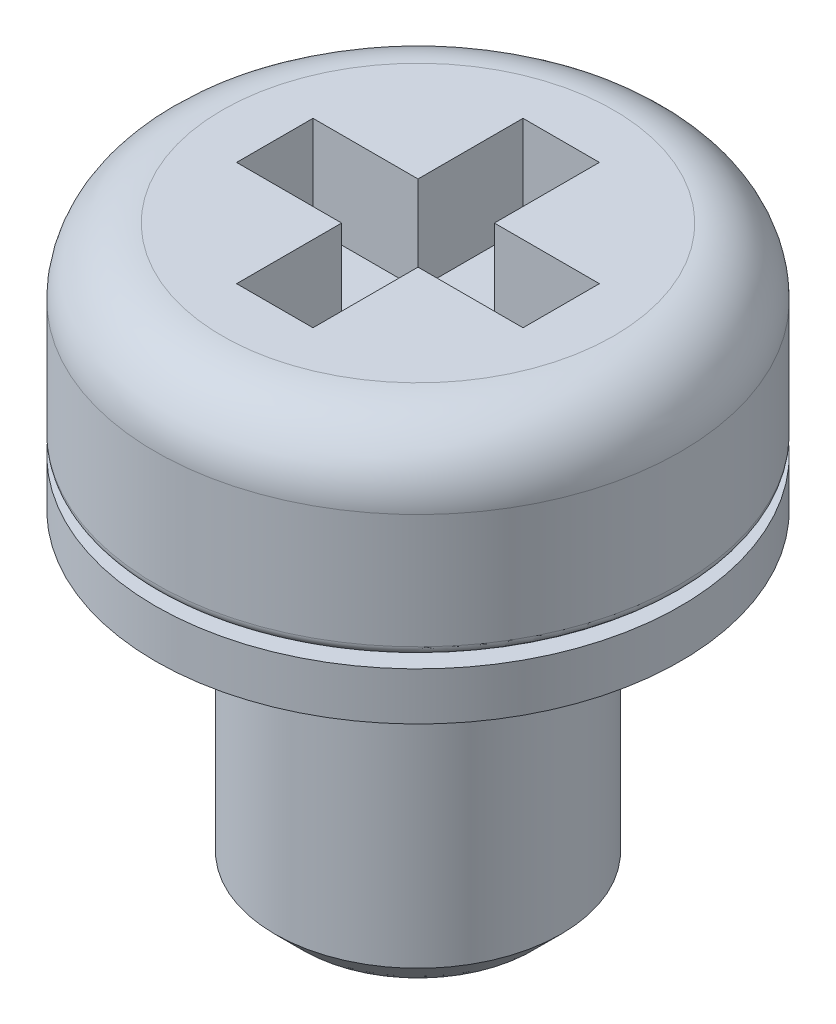
ISO-10303-21;
HEADER;
FILE_DESCRIPTION(('STEP AP214'),'2;1');
FILE_NAME('part.step','',(''),(''),'','','');
FILE_SCHEMA(('AUTOMOTIVE_DESIGN { 1 0 10303 214 1 1 1 1 }'));
ENDSEC;
DATA;
#1=APPLICATION_CONTEXT('core data for automotive mechanical design processes');
#2=APPLICATION_PROTOCOL_DEFINITION('international standard','automotive_design',2000,#1);
#3=PRODUCT_CONTEXT('',#1,'mechanical');
#4=PRODUCT('Part','Part','',(#3));
#5=PRODUCT_RELATED_PRODUCT_CATEGORY('part','',(#4));
#6=PRODUCT_DEFINITION_FORMATION('','',#4);
#7=PRODUCT_DEFINITION_CONTEXT('part definition',#1,'design');
#8=PRODUCT_DEFINITION('design','',#6,#7);
#9=PRODUCT_DEFINITION_SHAPE('','',#8);
#10=(LENGTH_UNIT() NAMED_UNIT(*) SI_UNIT(.MILLI.,.METRE.));
#11=(NAMED_UNIT(*) PLANE_ANGLE_UNIT() SI_UNIT($,.RADIAN.));
#12=(NAMED_UNIT(*) SI_UNIT($,.STERADIAN.) SOLID_ANGLE_UNIT());
#13=UNCERTAINTY_MEASURE_WITH_UNIT(LENGTH_MEASURE(1.E-05),#10,'distance_accuracy_value','');
#14=(GEOMETRIC_REPRESENTATION_CONTEXT(3) GLOBAL_UNCERTAINTY_ASSIGNED_CONTEXT((#13)) GLOBAL_UNIT_ASSIGNED_CONTEXT((#10,
#11,#12)) REPRESENTATION_CONTEXT('',''));
#15=CARTESIAN_POINT('',(0.,0.,0.));
#16=DIRECTION('',(0.,0.,1.));
#17=DIRECTION('',(1.,0.,0.));
#18=AXIS2_PLACEMENT_3D('',#15,#16,#17);
#19=CARTESIAN_POINT('',(68.752,0.1,-43.752));
#20=DIRECTION('',(0.,1.,0.));
#21=DIRECTION('',(1.,0.,0.));
#22=AXIS2_PLACEMENT_3D('',#19,#20,#21);
#23=PLANE('',#22);
#24=CARTESIAN_POINT('',(70.,0.0999999999758259,-45.));
#25=DIRECTION('',(0.,1.,0.));
#26=DIRECTION('',(0.,0.,1.));
#27=AXIS2_PLACEMENT_3D('',#24,#25,#26);
#28=CIRCLE('',#27,1.19999999997188);
#29=CARTESIAN_POINT('',(70.,0.0999999999758259,-43.8000000000281));
#30=VERTEX_POINT('',#29);
#31=EDGE_CURVE('P0_E165',#30,#30,#28,.F.);
#32=ORIENTED_EDGE('',*,*,#31,.T.);
#33=EDGE_LOOP('',(#32));
#34=FACE_BOUND('',#33,.T.);
#35=ADVANCED_FACE('P0_F17',(#34),#23,.F.);
#36=CARTESIAN_POINT('',(70.,0.0999999999758259,-45.));
#37=DIRECTION('',(0.,1.,0.));
#38=DIRECTION('',(0.,0.,1.));
#39=AXIS2_PLACEMENT_3D('',#36,#37,#38);
#40=CONICAL_SURFACE('',#39,1.19999999997188,0.785398163400928);
#41=CARTESIAN_POINT('',(70.,0.400000000000003,-45.));
#42=DIRECTION('',(0.,1.,0.));
#43=DIRECTION('',(1.,0.,0.));
#44=AXIS2_PLACEMENT_3D('',#41,#42,#43);
#45=CIRCLE('',#44,1.5);
#46=CARTESIAN_POINT('',(71.5,0.400000000000003,-45.));
#47=VERTEX_POINT('',#46);
#48=EDGE_CURVE('P0_E161',#47,#47,#45,.F.);
#49=ORIENTED_EDGE('',*,*,#48,.T.);
#50=EDGE_LOOP('',(#49));
#51=FACE_BOUND('',#50,.T.);
#52=ORIENTED_EDGE('',*,*,#31,.F.);
#53=EDGE_LOOP('',(#52));
#54=FACE_BOUND('',#53,.T.);
#55=ADVANCED_FACE('P0_F537',(#51,#54),#40,.T.);
#56=CARTESIAN_POINT('',(70.,0.400000000000003,-45.));
#57=DIRECTION('',(0.,1.,0.));
#58=DIRECTION('',(0.,0.,1.));
#59=AXIS2_PLACEMENT_3D('',#56,#57,#58);
#60=CYLINDRICAL_SURFACE('',#59,1.5);
#61=CARTESIAN_POINT('',(70.,3.5000000000001,-45.));
#62=DIRECTION('',(0.,1.,0.));
#63=DIRECTION('',(0.,0.,1.));
#64=AXIS2_PLACEMENT_3D('',#61,#62,#63);
#65=CIRCLE('',#64,1.5);
#66=CARTESIAN_POINT('',(70.,3.5000000000001,-43.5));
#67=VERTEX_POINT('',#66);
#68=EDGE_CURVE('P0_E164',#67,#67,#65,.T.);
#69=ORIENTED_EDGE('',*,*,#68,.F.);
#70=EDGE_LOOP('',(#69));
#71=FACE_BOUND('',#70,.T.);
#72=ORIENTED_EDGE('',*,*,#48,.F.);
#73=EDGE_LOOP('',(#72));
#74=FACE_BOUND('',#73,.T.);
#75=ADVANCED_FACE('P0_F527',(#71,#74),#60,.T.);
#76=CARTESIAN_POINT('',(67.13764442251,3.5,-42.14));
#77=DIRECTION('',(0.,-1.,0.));
#78=DIRECTION('',(0.,0.,-1.));
#79=AXIS2_PLACEMENT_3D('',#76,#77,#78);
#80=PLANE('',#79);
#81=ORIENTED_EDGE('',*,*,#68,.T.);
#82=EDGE_LOOP('',(#81));
#83=FACE_BOUND('',#82,.T.);
#84=CARTESIAN_POINT('',(70.,3.4999999999996,-45.));
#85=DIRECTION('',(0.,-1.,0.));
#86=DIRECTION('',(0.,0.,-1.));
#87=AXIS2_PLACEMENT_3D('',#84,#85,#86);
#88=CIRCLE('',#87,2.75);
#89=CARTESIAN_POINT('',(70.,3.4999999999996,-47.75));
#90=VERTEX_POINT('',#89);
#91=EDGE_CURVE('P0_E219',#90,#90,#88,.T.);
#92=ORIENTED_EDGE('',*,*,#91,.T.);
#93=EDGE_LOOP('',(#92));
#94=FACE_BOUND('',#93,.T.);
#95=ADVANCED_FACE('P0_F517',(#83,#94),#80,.T.);
#96=CARTESIAN_POINT('',(70.,4.00000000000041,-45.));
#97=DIRECTION('',(0.,-1.,0.));
#98=DIRECTION('',(0.,0.,-1.));
#99=AXIS2_PLACEMENT_3D('',#96,#97,#98);
#100=CYLINDRICAL_SURFACE('',#99,2.75);
#101=ORIENTED_EDGE('',*,*,#91,.F.);
#102=EDGE_LOOP('',(#101));
#103=FACE_BOUND('',#102,.T.);
#104=CARTESIAN_POINT('',(70.,4.00000000000041,-45.));
#105=DIRECTION('',(0.,-1.,0.));
#106=DIRECTION('',(0.,0.,-1.));
#107=AXIS2_PLACEMENT_3D('',#104,#105,#106);
#108=CIRCLE('',#107,2.75);
#109=CARTESIAN_POINT('',(70.,4.00000000000041,-47.75));
#110=VERTEX_POINT('',#109);
#111=EDGE_CURVE('P0_E216',#110,#110,#108,.T.);
#112=ORIENTED_EDGE('',*,*,#111,.T.);
#113=EDGE_LOOP('',(#112));
#114=FACE_BOUND('',#113,.T.);
#115=ADVANCED_FACE('P0_F507',(#103,#114),#100,.T.);
#116=CARTESIAN_POINT('',(67.13764442251,4.,-42.14));
#117=DIRECTION('',(0.,-1.,0.));
#118=DIRECTION('',(0.,0.,-1.));
#119=AXIS2_PLACEMENT_3D('',#116,#117,#118);
#120=PLANE('',#119);
#121=CARTESIAN_POINT('',(70.,3.99999999999998,-45.));
#122=DIRECTION('',(0.,1.,0.));
#123=DIRECTION('',(0.,0.,1.));
#124=AXIS2_PLACEMENT_3D('',#121,#122,#123);
#125=CIRCLE('',#124,1.5);
#126=CARTESIAN_POINT('',(70.,3.99999999999998,-43.5));
#127=VERTEX_POINT('',#126);
#128=EDGE_CURVE('P0_E143',#127,#127,#125,.F.);
#129=ORIENTED_EDGE('',*,*,#128,.T.);
#130=EDGE_LOOP('',(#129));
#131=FACE_BOUND('',#130,.T.);
#132=ORIENTED_EDGE('',*,*,#111,.F.);
#133=EDGE_LOOP('',(#132));
#134=FACE_BOUND('',#133,.T.);
#135=ADVANCED_FACE('P0_F498',(#131,#134),#120,.F.);
#136=CARTESIAN_POINT('',(71.56,5.1,-43.44));
#137=DIRECTION('',(0.,1.,0.));
#138=DIRECTION('',(0.,0.,-1.));
#139=AXIS2_PLACEMENT_3D('',#136,#137,#138);
#140=PLANE('',#139);
#141=DIRECTION('',(-1.,0.,0.));
#142=VECTOR('',#141,1.);
#143=CARTESIAN_POINT('',(69.05,5.1,-45.4));
#144=LINE('',#143,#142);
#145=CARTESIAN_POINT('',(69.6,5.1,-45.4));
#146=VERTEX_POINT('',#145);
#147=CARTESIAN_POINT('',(68.5,5.1,-45.4));
#148=VERTEX_POINT('',#147);
#149=EDGE_CURVE('P0_E150',#146,#148,#144,.T.);
#150=ORIENTED_EDGE('',*,*,#149,.T.);
#151=DIRECTION('',(0.,0.,1.));
#152=VECTOR('',#151,1.);
#153=CARTESIAN_POINT('',(68.5,5.1,-45.));
#154=LINE('',#153,#152);
#155=CARTESIAN_POINT('',(68.5,5.1,-44.6));
#156=VERTEX_POINT('',#155);
#157=EDGE_CURVE('P0_E142',#148,#156,#154,.T.);
#158=ORIENTED_EDGE('',*,*,#157,.T.);
#159=DIRECTION('',(1.,0.,0.));
#160=VECTOR('',#159,1.);
#161=CARTESIAN_POINT('',(69.05,5.1,-44.6));
#162=LINE('',#161,#160);
#163=CARTESIAN_POINT('',(69.6,5.1,-44.6));
#164=VERTEX_POINT('',#163);
#165=EDGE_CURVE('P0_E131',#156,#164,#162,.T.);
#166=ORIENTED_EDGE('',*,*,#165,.T.);
#167=DIRECTION('',(0.,0.,1.));
#168=VECTOR('',#167,1.);
#169=CARTESIAN_POINT('',(69.6,5.1,-44.05));
#170=LINE('',#169,#168);
#171=CARTESIAN_POINT('',(69.6,5.1,-43.5));
#172=VERTEX_POINT('',#171);
#173=EDGE_CURVE('P0_E290',#164,#172,#170,.T.);
#174=ORIENTED_EDGE('',*,*,#173,.T.);
#175=DIRECTION('',(1.,0.,0.));
#176=VECTOR('',#175,1.);
#177=CARTESIAN_POINT('',(70.,5.1,-43.5));
#178=LINE('',#177,#176);
#179=CARTESIAN_POINT('',(70.4,5.1,-43.5));
#180=VERTEX_POINT('',#179);
#181=EDGE_CURVE('P0_E296',#172,#180,#178,.T.);
#182=ORIENTED_EDGE('',*,*,#181,.T.);
#183=DIRECTION('',(0.,0.,-1.));
#184=VECTOR('',#183,1.);
#185=CARTESIAN_POINT('',(70.4,5.1,-44.05));
#186=LINE('',#185,#184);
#187=CARTESIAN_POINT('',(70.4,5.1,-44.6));
#188=VERTEX_POINT('',#187);
#189=EDGE_CURVE('P0_E302',#180,#188,#186,.T.);
#190=ORIENTED_EDGE('',*,*,#189,.T.);
#191=DIRECTION('',(1.,0.,0.));
#192=VECTOR('',#191,1.);
#193=CARTESIAN_POINT('',(70.95,5.1,-44.6));
#194=LINE('',#193,#192);
#195=CARTESIAN_POINT('',(71.5,5.1,-44.6));
#196=VERTEX_POINT('',#195);
#197=EDGE_CURVE('P0_E308',#188,#196,#194,.T.);
#198=ORIENTED_EDGE('',*,*,#197,.T.);
#199=DIRECTION('',(0.,0.,-1.));
#200=VECTOR('',#199,1.);
#201=CARTESIAN_POINT('',(71.5,5.1,-45.));
#202=LINE('',#201,#200);
#203=CARTESIAN_POINT('',(71.5,5.1,-45.4));
#204=VERTEX_POINT('',#203);
#205=EDGE_CURVE('P0_E314',#196,#204,#202,.T.);
#206=ORIENTED_EDGE('',*,*,#205,.T.);
#207=DIRECTION('',(-1.,0.,0.));
#208=VECTOR('',#207,1.);
#209=CARTESIAN_POINT('',(70.95,5.1,-45.4));
#210=LINE('',#209,#208);
#211=CARTESIAN_POINT('',(70.4,5.1,-45.4));
#212=VERTEX_POINT('',#211);
#213=EDGE_CURVE('P0_E320',#204,#212,#210,.T.);
#214=ORIENTED_EDGE('',*,*,#213,.T.);
#215=DIRECTION('',(0.,0.,-1.));
#216=VECTOR('',#215,1.);
#217=CARTESIAN_POINT('',(70.4,5.1,-45.95));
#218=LINE('',#217,#216);
#219=CARTESIAN_POINT('',(70.4,5.1,-46.5));
#220=VERTEX_POINT('',#219);
#221=EDGE_CURVE('P0_E326',#212,#220,#218,.T.);
#222=ORIENTED_EDGE('',*,*,#221,.T.);
#223=DIRECTION('',(-1.,0.,0.));
#224=VECTOR('',#223,1.);
#225=CARTESIAN_POINT('',(70.,5.1,-46.5));
#226=LINE('',#225,#224);
#227=CARTESIAN_POINT('',(69.6,5.1,-46.5));
#228=VERTEX_POINT('',#227);
#229=EDGE_CURVE('P0_E332',#220,#228,#226,.T.);
#230=ORIENTED_EDGE('',*,*,#229,.T.);
#231=DIRECTION('',(0.,0.,1.));
#232=VECTOR('',#231,1.);
#233=CARTESIAN_POINT('',(69.6,5.1,-45.95));
#234=LINE('',#233,#232);
#235=EDGE_CURVE('P0_E338',#228,#146,#234,.T.);
#236=ORIENTED_EDGE('',*,*,#235,.T.);
#237=EDGE_LOOP('',(#150,#158,#166,#174,#182,#190,#198,#206,#214,#222,#230,#236));
#238=FACE_BOUND('',#237,.T.);
#239=ADVANCED_FACE('P0_F153',(#238),#140,.T.);
#240=CARTESIAN_POINT('',(70.,3.99999999999998,-45.));
#241=DIRECTION('',(0.,1.,0.));
#242=DIRECTION('',(0.,0.,1.));
#243=AXIS2_PLACEMENT_3D('',#240,#241,#242);
#244=CYLINDRICAL_SURFACE('',#243,1.5);
#245=CARTESIAN_POINT('',(70.,4.09999999999988,-45.));
#246=DIRECTION('',(0.,1.,0.));
#247=DIRECTION('',(0.,0.,1.));
#248=AXIS2_PLACEMENT_3D('',#245,#246,#247);
#249=CIRCLE('',#248,1.5);
#250=CARTESIAN_POINT('',(70.,4.09999999999988,-43.5));
#251=VERTEX_POINT('',#250);
#252=EDGE_CURVE('P0_E206',#251,#251,#249,.F.);
#253=ORIENTED_EDGE('',*,*,#252,.T.);
#254=EDGE_LOOP('',(#253));
#255=FACE_BOUND('',#254,.T.);
#256=ORIENTED_EDGE('',*,*,#128,.F.);
#257=EDGE_LOOP('',(#256));
#258=FACE_BOUND('',#257,.T.);
#259=ADVANCED_FACE('P0_F481',(#255,#258),#244,.T.);
#260=CARTESIAN_POINT('',(68.478,5.08,-44.6));
#261=DIRECTION('',(0.,0.,1.));
#262=DIRECTION('',(1.,0.,0.));
#263=AXIS2_PLACEMENT_3D('',#260,#261,#262);
#264=PLANE('',#263);
#265=ORIENTED_EDGE('',*,*,#165,.F.);
#266=DIRECTION('',(0.,1.,0.));
#267=VECTOR('',#266,1.);
#268=CARTESIAN_POINT('',(68.5,5.6,-44.6));
#269=LINE('',#268,#267);
#270=CARTESIAN_POINT('',(68.5,6.1,-44.6));
#271=VERTEX_POINT('',#270);
#272=EDGE_CURVE('P0_E135',#156,#271,#269,.T.);
#273=ORIENTED_EDGE('',*,*,#272,.T.);
#274=DIRECTION('',(-1.,0.,0.));
#275=VECTOR('',#274,1.);
#276=CARTESIAN_POINT('',(70.,6.1,-44.6));
#277=LINE('',#276,#275);
#278=CARTESIAN_POINT('',(69.6,6.1,-44.6));
#279=VERTEX_POINT('',#278);
#280=EDGE_CURVE('P0_E269',#279,#271,#277,.T.);
#281=ORIENTED_EDGE('',*,*,#280,.F.);
#282=DIRECTION('',(0.,-1.,0.));
#283=VECTOR('',#282,1.);
#284=CARTESIAN_POINT('',(69.6,5.6,-44.6));
#285=LINE('',#284,#283);
#286=EDGE_CURVE('P0_E137',#279,#164,#285,.T.);
#287=ORIENTED_EDGE('',*,*,#286,.T.);
#288=EDGE_LOOP('',(#265,#273,#281,#287));
#289=FACE_BOUND('',#288,.T.);
#290=ADVANCED_FACE('P0_F133',(#289),#264,.F.);
#291=CARTESIAN_POINT('',(68.5,5.08,-45.416));
#292=DIRECTION('',(-1.,0.,0.));
#293=DIRECTION('',(0.,0.,1.));
#294=AXIS2_PLACEMENT_3D('',#291,#292,#293);
#295=PLANE('',#294);
#296=ORIENTED_EDGE('',*,*,#157,.F.);
#297=DIRECTION('',(0.,1.,0.));
#298=VECTOR('',#297,1.);
#299=CARTESIAN_POINT('',(68.5,5.6,-45.4));
#300=LINE('',#299,#298);
#301=CARTESIAN_POINT('',(68.5,6.1,-45.4));
#302=VERTEX_POINT('',#301);
#303=EDGE_CURVE('P0_E340',#148,#302,#300,.T.);
#304=ORIENTED_EDGE('',*,*,#303,.T.);
#305=DIRECTION('',(0.,0.,-1.));
#306=VECTOR('',#305,1.);
#307=CARTESIAN_POINT('',(68.5,6.1,-45.));
#308=LINE('',#307,#306);
#309=EDGE_CURVE('P0_E149',#271,#302,#308,.T.);
#310=ORIENTED_EDGE('',*,*,#309,.F.);
#311=ORIENTED_EDGE('',*,*,#272,.F.);
#312=EDGE_LOOP('',(#296,#304,#310,#311));
#313=FACE_BOUND('',#312,.T.);
#314=ADVANCED_FACE('P0_F146',(#313),#295,.F.);
#315=CARTESIAN_POINT('',(69.622,5.08,-45.4));
#316=DIRECTION('',(0.,0.,-1.));
#317=DIRECTION('',(-1.,0.,0.));
#318=AXIS2_PLACEMENT_3D('',#315,#316,#317);
#319=PLANE('',#318);
#320=ORIENTED_EDGE('',*,*,#149,.F.);
#321=DIRECTION('',(0.,1.,0.));
#322=VECTOR('',#321,1.);
#323=CARTESIAN_POINT('',(69.6,5.6,-45.4));
#324=LINE('',#323,#322);
#325=CARTESIAN_POINT('',(69.6,6.1,-45.4));
#326=VERTEX_POINT('',#325);
#327=EDGE_CURVE('P0_E335',#146,#326,#324,.T.);
#328=ORIENTED_EDGE('',*,*,#327,.T.);
#329=DIRECTION('',(1.,0.,0.));
#330=VECTOR('',#329,1.);
#331=CARTESIAN_POINT('',(70.,6.1,-45.4));
#332=LINE('',#331,#330);
#333=EDGE_CURVE('P0_E266',#302,#326,#332,.T.);
#334=ORIENTED_EDGE('',*,*,#333,.F.);
#335=ORIENTED_EDGE('',*,*,#303,.F.);
#336=EDGE_LOOP('',(#320,#328,#334,#335));
#337=FACE_BOUND('',#336,.T.);
#338=ADVANCED_FACE('P0_F343',(#337),#319,.F.);
#339=CARTESIAN_POINT('',(69.6,5.08,-46.522));
#340=DIRECTION('',(-1.,0.,0.));
#341=DIRECTION('',(0.,0.,1.));
#342=AXIS2_PLACEMENT_3D('',#339,#340,#341);
#343=PLANE('',#342);
#344=ORIENTED_EDGE('',*,*,#235,.F.);
#345=DIRECTION('',(0.,1.,0.));
#346=VECTOR('',#345,1.);
#347=CARTESIAN_POINT('',(69.6,5.6,-46.5));
#348=LINE('',#347,#346);
#349=CARTESIAN_POINT('',(69.6,6.1,-46.5));
#350=VERTEX_POINT('',#349);
#351=EDGE_CURVE('P0_E329',#228,#350,#348,.T.);
#352=ORIENTED_EDGE('',*,*,#351,.T.);
#353=DIRECTION('',(0.,0.,-1.));
#354=VECTOR('',#353,1.);
#355=CARTESIAN_POINT('',(69.6,6.1,-45.));
#356=LINE('',#355,#354);
#357=EDGE_CURVE('P0_E264',#326,#350,#356,.T.);
#358=ORIENTED_EDGE('',*,*,#357,.F.);
#359=ORIENTED_EDGE('',*,*,#327,.F.);
#360=EDGE_LOOP('',(#344,#352,#358,#359));
#361=FACE_BOUND('',#360,.T.);
#362=ADVANCED_FACE('P0_F377',(#361),#343,.F.);
#363=CARTESIAN_POINT('',(70.416,5.08,-46.5));
#364=DIRECTION('',(0.,0.,-1.));
#365=DIRECTION('',(-1.,0.,0.));
#366=AXIS2_PLACEMENT_3D('',#363,#364,#365);
#367=PLANE('',#366);
#368=ORIENTED_EDGE('',*,*,#229,.F.);
#369=DIRECTION('',(0.,1.,0.));
#370=VECTOR('',#369,1.);
#371=CARTESIAN_POINT('',(70.4,5.6,-46.5));
#372=LINE('',#371,#370);
#373=CARTESIAN_POINT('',(70.4,6.1,-46.5));
#374=VERTEX_POINT('',#373);
#375=EDGE_CURVE('P0_E323',#220,#374,#372,.T.);
#376=ORIENTED_EDGE('',*,*,#375,.T.);
#377=DIRECTION('',(1.,0.,0.));
#378=VECTOR('',#377,1.);
#379=CARTESIAN_POINT('',(70.,6.1,-46.5));
#380=LINE('',#379,#378);
#381=EDGE_CURVE('P0_E262',#350,#374,#380,.T.);
#382=ORIENTED_EDGE('',*,*,#381,.F.);
#383=ORIENTED_EDGE('',*,*,#351,.F.);
#384=EDGE_LOOP('',(#368,#376,#382,#383));
#385=FACE_BOUND('',#384,.T.);
#386=ADVANCED_FACE('P0_F374',(#385),#367,.F.);
#387=CARTESIAN_POINT('',(70.4,5.08,-45.378));
#388=DIRECTION('',(1.,0.,0.));
#389=DIRECTION('',(0.,0.,-1.));
#390=AXIS2_PLACEMENT_3D('',#387,#388,#389);
#391=PLANE('',#390);
#392=ORIENTED_EDGE('',*,*,#221,.F.);
#393=DIRECTION('',(0.,1.,0.));
#394=VECTOR('',#393,1.);
#395=CARTESIAN_POINT('',(70.4,5.6,-45.4));
#396=LINE('',#395,#394);
#397=CARTESIAN_POINT('',(70.4,6.1,-45.4));
#398=VERTEX_POINT('',#397);
#399=EDGE_CURVE('P0_E317',#212,#398,#396,.T.);
#400=ORIENTED_EDGE('',*,*,#399,.T.);
#401=DIRECTION('',(0.,0.,1.));
#402=VECTOR('',#401,1.);
#403=CARTESIAN_POINT('',(70.4,6.1,-45.));
#404=LINE('',#403,#402);
#405=EDGE_CURVE('P0_E260',#374,#398,#404,.T.);
#406=ORIENTED_EDGE('',*,*,#405,.F.);
#407=ORIENTED_EDGE('',*,*,#375,.F.);
#408=EDGE_LOOP('',(#392,#400,#406,#407));
#409=FACE_BOUND('',#408,.T.);
#410=ADVANCED_FACE('P0_F370',(#409),#391,.F.);
#411=CARTESIAN_POINT('',(71.522,5.08,-45.4));
#412=DIRECTION('',(0.,0.,-1.));
#413=DIRECTION('',(-1.,0.,0.));
#414=AXIS2_PLACEMENT_3D('',#411,#412,#413);
#415=PLANE('',#414);
#416=ORIENTED_EDGE('',*,*,#213,.F.);
#417=DIRECTION('',(0.,1.,0.));
#418=VECTOR('',#417,1.);
#419=CARTESIAN_POINT('',(71.5,5.6,-45.4));
#420=LINE('',#419,#418);
#421=CARTESIAN_POINT('',(71.5,6.1,-45.4));
#422=VERTEX_POINT('',#421);
#423=EDGE_CURVE('P0_E311',#204,#422,#420,.T.);
#424=ORIENTED_EDGE('',*,*,#423,.T.);
#425=DIRECTION('',(1.,0.,0.));
#426=VECTOR('',#425,1.);
#427=CARTESIAN_POINT('',(70.,6.1,-45.4));
#428=LINE('',#427,#426);
#429=EDGE_CURVE('P0_E258',#398,#422,#428,.T.);
#430=ORIENTED_EDGE('',*,*,#429,.F.);
#431=ORIENTED_EDGE('',*,*,#399,.F.);
#432=EDGE_LOOP('',(#416,#424,#430,#431));
#433=FACE_BOUND('',#432,.T.);
#434=ADVANCED_FACE('P0_F366',(#433),#415,.F.);
#435=CARTESIAN_POINT('',(71.5,5.08,-44.584));
#436=DIRECTION('',(1.,0.,0.));
#437=DIRECTION('',(0.,0.,-1.));
#438=AXIS2_PLACEMENT_3D('',#435,#436,#437);
#439=PLANE('',#438);
#440=ORIENTED_EDGE('',*,*,#205,.F.);
#441=DIRECTION('',(0.,1.,0.));
#442=VECTOR('',#441,1.);
#443=CARTESIAN_POINT('',(71.5,5.6,-44.6));
#444=LINE('',#443,#442);
#445=CARTESIAN_POINT('',(71.5,6.1,-44.6));
#446=VERTEX_POINT('',#445);
#447=EDGE_CURVE('P0_E305',#196,#446,#444,.T.);
#448=ORIENTED_EDGE('',*,*,#447,.T.);
#449=DIRECTION('',(0.,0.,1.));
#450=VECTOR('',#449,1.);
#451=CARTESIAN_POINT('',(71.5,6.1,-45.));
#452=LINE('',#451,#450);
#453=EDGE_CURVE('P0_E256',#422,#446,#452,.T.);
#454=ORIENTED_EDGE('',*,*,#453,.F.);
#455=ORIENTED_EDGE('',*,*,#423,.F.);
#456=EDGE_LOOP('',(#440,#448,#454,#455));
#457=FACE_BOUND('',#456,.T.);
#458=ADVANCED_FACE('P0_F362',(#457),#439,.F.);
#459=CARTESIAN_POINT('',(70.378,5.08,-44.6));
#460=DIRECTION('',(0.,0.,1.));
#461=DIRECTION('',(1.,0.,0.));
#462=AXIS2_PLACEMENT_3D('',#459,#460,#461);
#463=PLANE('',#462);
#464=ORIENTED_EDGE('',*,*,#197,.F.);
#465=DIRECTION('',(0.,1.,0.));
#466=VECTOR('',#465,1.);
#467=CARTESIAN_POINT('',(70.4,5.6,-44.6));
#468=LINE('',#467,#466);
#469=CARTESIAN_POINT('',(70.4,6.1,-44.6));
#470=VERTEX_POINT('',#469);
#471=EDGE_CURVE('P0_E299',#188,#470,#468,.T.);
#472=ORIENTED_EDGE('',*,*,#471,.T.);
#473=DIRECTION('',(-1.,0.,0.));
#474=VECTOR('',#473,1.);
#475=CARTESIAN_POINT('',(70.,6.1,-44.6));
#476=LINE('',#475,#474);
#477=EDGE_CURVE('P0_E254',#446,#470,#476,.T.);
#478=ORIENTED_EDGE('',*,*,#477,.F.);
#479=ORIENTED_EDGE('',*,*,#447,.F.);
#480=EDGE_LOOP('',(#464,#472,#478,#479));
#481=FACE_BOUND('',#480,.T.);
#482=ADVANCED_FACE('P0_F358',(#481),#463,.F.);
#483=CARTESIAN_POINT('',(70.4,5.08,-43.478));
#484=DIRECTION('',(1.,0.,0.));
#485=DIRECTION('',(0.,0.,-1.));
#486=AXIS2_PLACEMENT_3D('',#483,#484,#485);
#487=PLANE('',#486);
#488=ORIENTED_EDGE('',*,*,#189,.F.);
#489=DIRECTION('',(0.,1.,0.));
#490=VECTOR('',#489,1.);
#491=CARTESIAN_POINT('',(70.4,5.6,-43.5));
#492=LINE('',#491,#490);
#493=CARTESIAN_POINT('',(70.4,6.1,-43.5));
#494=VERTEX_POINT('',#493);
#495=EDGE_CURVE('P0_E293',#180,#494,#492,.T.);
#496=ORIENTED_EDGE('',*,*,#495,.T.);
#497=DIRECTION('',(0.,0.,1.));
#498=VECTOR('',#497,1.);
#499=CARTESIAN_POINT('',(70.4,6.1,-45.));
#500=LINE('',#499,#498);
#501=EDGE_CURVE('P0_E252',#470,#494,#500,.T.);
#502=ORIENTED_EDGE('',*,*,#501,.F.);
#503=ORIENTED_EDGE('',*,*,#471,.F.);
#504=EDGE_LOOP('',(#488,#496,#502,#503));
#505=FACE_BOUND('',#504,.T.);
#506=ADVANCED_FACE('P0_F354',(#505),#487,.F.);
#507=CARTESIAN_POINT('',(69.584,5.08,-43.5));
#508=DIRECTION('',(0.,0.,1.));
#509=DIRECTION('',(1.,0.,0.));
#510=AXIS2_PLACEMENT_3D('',#507,#508,#509);
#511=PLANE('',#510);
#512=ORIENTED_EDGE('',*,*,#181,.F.);
#513=DIRECTION('',(0.,1.,0.));
#514=VECTOR('',#513,1.);
#515=CARTESIAN_POINT('',(69.6,5.6,-43.5));
#516=LINE('',#515,#514);
#517=CARTESIAN_POINT('',(69.6,6.1,-43.5));
#518=VERTEX_POINT('',#517);
#519=EDGE_CURVE('P0_E283',#172,#518,#516,.T.);
#520=ORIENTED_EDGE('',*,*,#519,.T.);
#521=DIRECTION('',(-1.,0.,0.));
#522=VECTOR('',#521,1.);
#523=CARTESIAN_POINT('',(70.,6.1,-43.5));
#524=LINE('',#523,#522);
#525=EDGE_CURVE('P0_E60',#494,#518,#524,.T.);
#526=ORIENTED_EDGE('',*,*,#525,.F.);
#527=ORIENTED_EDGE('',*,*,#495,.F.);
#528=EDGE_LOOP('',(#512,#520,#526,#527));
#529=FACE_BOUND('',#528,.T.);
#530=ADVANCED_FACE('P0_F351',(#529),#511,.F.);
#531=CARTESIAN_POINT('',(69.6,5.08,-44.622));
#532=DIRECTION('',(-1.,0.,0.));
#533=DIRECTION('',(0.,0.,1.));
#534=AXIS2_PLACEMENT_3D('',#531,#532,#533);
#535=PLANE('',#534);
#536=ORIENTED_EDGE('',*,*,#173,.F.);
#537=ORIENTED_EDGE('',*,*,#286,.F.);
#538=DIRECTION('',(0.,0.,-1.));
#539=VECTOR('',#538,1.);
#540=CARTESIAN_POINT('',(69.6,6.1,-45.));
#541=LINE('',#540,#539);
#542=EDGE_CURVE('P0_E249',#518,#279,#541,.T.);
#543=ORIENTED_EDGE('',*,*,#542,.F.);
#544=ORIENTED_EDGE('',*,*,#519,.F.);
#545=EDGE_LOOP('',(#536,#537,#543,#544));
#546=FACE_BOUND('',#545,.T.);
#547=ADVANCED_FACE('P0_F180',(#546),#535,.F.);
#548=CARTESIAN_POINT('',(67.244,4.1,-42.244));
#549=DIRECTION('',(0.,1.,0.));
#550=DIRECTION('',(1.,0.,0.));
#551=AXIS2_PLACEMENT_3D('',#548,#549,#550);
#552=PLANE('',#551);
#553=ORIENTED_EDGE('',*,*,#252,.F.);
#554=EDGE_LOOP('',(#553));
#555=FACE_BOUND('',#554,.T.);
#556=CARTESIAN_POINT('',(70.,4.1,-45.));
#557=DIRECTION('',(0.,1.,0.));
#558=DIRECTION('',(-1.,0.,2.28852576302784E-12));
#559=AXIS2_PLACEMENT_3D('',#556,#557,#558);
#560=CIRCLE('',#559,2.64999999999613);
#561=CARTESIAN_POINT('',(72.6499999999977,4.1,-45.0000000000036));
#562=VERTEX_POINT('',#561);
#563=CARTESIAN_POINT('',(67.3500000000023,4.1,-44.9999999999964));
#564=VERTEX_POINT('',#563);
#565=EDGE_CURVE('P0_E167',#562,#564,#560,.F.);
#566=ORIENTED_EDGE('',*,*,#565,.T.);
#567=CARTESIAN_POINT('',(70.,4.1,-45.));
#568=DIRECTION('',(0.,1.,0.));
#569=DIRECTION('',(1.,0.,-2.29114421355762E-12));
#570=AXIS2_PLACEMENT_3D('',#567,#568,#569);
#571=CIRCLE('',#570,2.64999999999613);
#572=EDGE_CURVE('P0_E48',#562,#564,#571,.T.);
#573=ORIENTED_EDGE('',*,*,#572,.F.);
#574=EDGE_LOOP('',(#566,#573));
#575=FACE_BOUND('',#574,.T.);
#576=ADVANCED_FACE('P0_F171',(#555,#575),#552,.F.);
#577=CARTESIAN_POINT('',(67.868,6.1,-42.868));
#578=DIRECTION('',(0.,1.,0.));
#579=DIRECTION('',(1.,0.,0.));
#580=AXIS2_PLACEMENT_3D('',#577,#578,#579);
#581=PLANE('',#580);
#582=ORIENTED_EDGE('',*,*,#525,.T.);
#583=ORIENTED_EDGE('',*,*,#542,.T.);
#584=ORIENTED_EDGE('',*,*,#280,.T.);
#585=ORIENTED_EDGE('',*,*,#309,.T.);
#586=ORIENTED_EDGE('',*,*,#333,.T.);
#587=ORIENTED_EDGE('',*,*,#357,.T.);
#588=ORIENTED_EDGE('',*,*,#381,.T.);
#589=ORIENTED_EDGE('',*,*,#405,.T.);
#590=ORIENTED_EDGE('',*,*,#429,.T.);
#591=ORIENTED_EDGE('',*,*,#453,.T.);
#592=ORIENTED_EDGE('',*,*,#477,.T.);
#593=ORIENTED_EDGE('',*,*,#501,.T.);
#594=EDGE_LOOP('',(#582,#583,#584,#585,#586,#587,#588,#589,#590,#591,#592,#593));
#595=FACE_BOUND('',#594,.T.);
#596=CARTESIAN_POINT('',(70.,6.1,-45.));
#597=DIRECTION('',(0.,-1.,0.));
#598=DIRECTION('',(-1.,0.,4.70490854948038E-13));
#599=AXIS2_PLACEMENT_3D('',#596,#597,#598);
#600=CIRCLE('',#599,2.04999999999921);
#601=CARTESIAN_POINT('',(72.0499999999995,6.1,-45.0000000000006));
#602=VERTEX_POINT('',#601);
#603=CARTESIAN_POINT('',(67.9500000000005,6.1,-44.9999999999994));
#604=VERTEX_POINT('',#603);
#605=EDGE_CURVE('P0_E38',#602,#604,#600,.F.);
#606=ORIENTED_EDGE('',*,*,#605,.T.);
#607=CARTESIAN_POINT('',(70.,6.1,-45.));
#608=DIRECTION('',(0.,-1.,0.));
#609=DIRECTION('',(1.,0.,-4.70490854948042E-13));
#610=AXIS2_PLACEMENT_3D('',#607,#608,#609);
#611=CIRCLE('',#610,2.04999999999919);
#612=EDGE_CURVE('P0_E160',#604,#602,#611,.F.);
#613=ORIENTED_EDGE('',*,*,#612,.T.);
#614=EDGE_LOOP('',(#606,#613));
#615=FACE_BOUND('',#614,.T.);
#616=ADVANCED_FACE('P0_F19',(#595,#615),#581,.T.);
#617=CARTESIAN_POINT('',(70.,4.2,-45.));
#618=DIRECTION('',(0.,1.,0.));
#619=DIRECTION('',(0.999969531212782,0.,-0.00780619280378661));
#620=AXIS2_PLACEMENT_3D('',#617,#618,#619);
#621=TOROIDAL_SURFACE('',#620,2.64999999999612,0.1);
#622=CARTESIAN_POINT('',(70.,4.2,-45.));
#623=DIRECTION('',(0.,1.,0.));
#624=DIRECTION('',(1.,0.,0.));
#625=AXIS2_PLACEMENT_3D('',#622,#623,#624);
#626=CIRCLE('',#625,2.74999999999999);
#627=CARTESIAN_POINT('',(72.75,4.2,-45.));
#628=VERTEX_POINT('',#627);
#629=EDGE_CURVE('P0_E30',#628,#628,#626,.F.);
#630=ORIENTED_EDGE('',*,*,#629,.T.);
#631=EDGE_LOOP('',(#630));
#632=FACE_BOUND('',#631,.T.);
#633=ORIENTED_EDGE('',*,*,#565,.F.);
#634=ORIENTED_EDGE('',*,*,#572,.T.);
#635=EDGE_LOOP('',(#633,#634));
#636=FACE_BOUND('',#635,.T.);
#637=ADVANCED_FACE('P0_F240',(#632,#636),#621,.T.);
#638=CARTESIAN_POINT('',(70.,5.4,-45.));
#639=DIRECTION('',(0.,1.,0.));
#640=DIRECTION('',(0.999986040741819,0.,-0.00528377909269088));
#641=AXIS2_PLACEMENT_3D('',#638,#639,#640);
#642=TOROIDAL_SURFACE('',#641,2.04999999999926,0.7);
#643=ORIENTED_EDGE('',*,*,#605,.F.);
#644=ORIENTED_EDGE('',*,*,#612,.F.);
#645=EDGE_LOOP('',(#643,#644));
#646=FACE_BOUND('',#645,.T.);
#647=CARTESIAN_POINT('',(70.,5.39999999999996,-45.));
#648=DIRECTION('',(0.,1.,0.));
#649=DIRECTION('',(1.,0.,0.));
#650=AXIS2_PLACEMENT_3D('',#647,#648,#649);
#651=CIRCLE('',#650,2.74999999999999);
#652=CARTESIAN_POINT('',(72.75,5.39999999999996,-45.));
#653=VERTEX_POINT('',#652);
#654=EDGE_CURVE('P0_E11',#653,#653,#651,.T.);
#655=ORIENTED_EDGE('',*,*,#654,.T.);
#656=EDGE_LOOP('',(#655));
#657=FACE_BOUND('',#656,.T.);
#658=ADVANCED_FACE('P0_F229',(#646,#657),#642,.T.);
#659=CARTESIAN_POINT('',(70.,4.2,-45.));
#660=DIRECTION('',(0.,1.,0.));
#661=DIRECTION('',(0.,0.,1.));
#662=AXIS2_PLACEMENT_3D('',#659,#660,#661);
#663=CYLINDRICAL_SURFACE('',#662,2.74999999999999);
#664=ORIENTED_EDGE('',*,*,#654,.F.);
#665=EDGE_LOOP('',(#664));
#666=FACE_BOUND('',#665,.T.);
#667=ORIENTED_EDGE('',*,*,#629,.F.);
#668=EDGE_LOOP('',(#667));
#669=FACE_BOUND('',#668,.T.);
#670=ADVANCED_FACE('P0_F239',(#666,#669),#663,.T.);
#671=CLOSED_SHELL('',(#35,#55,#75,#95,#115,#135,#239,#259,#290,#314,#338,#362,#386,#410,#434,
#458,#482,#506,#530,#547,#576,#616,#637,#658,#670));
#672=MANIFOLD_SOLID_BREP('P0_B1',#671);
#673=CARTESIAN_POINT('',(70.,0.150000000000013,-45.));
#674=DIRECTION('',(0.,1.,0.));
#675=DIRECTION('',(0.,0.,1.));
#676=AXIS2_PLACEMENT_3D('',#673,#674,#675);
#677=CYLINDRICAL_SURFACE('',#676,1.25);
#678=CARTESIAN_POINT('',(70.,4.09999999999988,-45.));
#679=DIRECTION('',(0.,1.,0.));
#680=DIRECTION('',(-1.,0.,0.));
#681=AXIS2_PLACEMENT_3D('',#678,#679,#680);
#682=CIRCLE('',#681,1.25);
#683=CARTESIAN_POINT('',(68.75,4.09999999999988,-45.));
#684=VERTEX_POINT('',#683);
#685=EDGE_CURVE('P1_E10',#684,#684,#682,.T.);
#686=ORIENTED_EDGE('',*,*,#685,.T.);
#687=EDGE_LOOP('',(#686));
#688=FACE_BOUND('',#687,.T.);
#689=CARTESIAN_POINT('',(70.,0.150000000000013,-45.));
#690=DIRECTION('',(0.,1.,0.));
#691=DIRECTION('',(-1.,0.,0.));
#692=AXIS2_PLACEMENT_3D('',#689,#690,#691);
#693=CIRCLE('',#692,1.25);
#694=CARTESIAN_POINT('',(68.75,0.150000000000013,-45.));
#695=VERTEX_POINT('',#694);
#696=EDGE_CURVE('P1_E16',#695,#695,#693,.F.);
#697=ORIENTED_EDGE('',*,*,#696,.T.);
#698=EDGE_LOOP('',(#697));
#699=FACE_BOUND('',#698,.T.);
#700=ADVANCED_FACE('P1_F15',(#688,#699),#677,.F.);
#701=OPEN_SHELL('',(#700));
#702=SHELL_BASED_SURFACE_MODEL('P1_B1',(#701));
#703=ADVANCED_BREP_SHAPE_REPRESENTATION('',(#18,#672),#14);
#704=MANIFOLD_SURFACE_SHAPE_REPRESENTATION('',(#18,#702),#14);
#705=SHAPE_REPRESENTATION('',(#18),#14);
#706=SHAPE_DEFINITION_REPRESENTATION(#9,#705);
#707=SHAPE_REPRESENTATION_RELATIONSHIP('','',#705,#703);
#708=SHAPE_REPRESENTATION_RELATIONSHIP('','',#705,#704);
ENDSEC;
END-ISO-10303-21;
